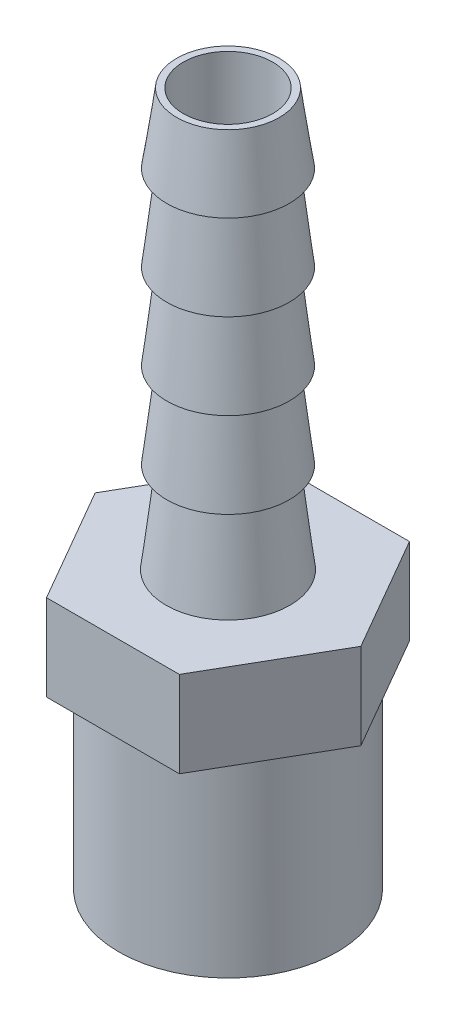
ISO-10303-21;
HEADER;
FILE_DESCRIPTION(('STEP AP214'),'2;1');
FILE_NAME('part.step','',(''),(''),'','','');
FILE_SCHEMA(('AUTOMOTIVE_DESIGN { 1 0 10303 214 1 1 1 1 }'));
ENDSEC;
DATA;
#1=APPLICATION_CONTEXT('core data for automotive mechanical design processes');
#2=APPLICATION_PROTOCOL_DEFINITION('international standard','automotive_design',2000,#1);
#3=PRODUCT_CONTEXT('',#1,'mechanical');
#4=PRODUCT('Part','Part','',(#3));
#5=PRODUCT_RELATED_PRODUCT_CATEGORY('part','',(#4));
#6=PRODUCT_DEFINITION_FORMATION('','',#4);
#7=PRODUCT_DEFINITION_CONTEXT('part definition',#1,'design');
#8=PRODUCT_DEFINITION('design','',#6,#7);
#9=PRODUCT_DEFINITION_SHAPE('','',#8);
#10=(LENGTH_UNIT() NAMED_UNIT(*) SI_UNIT(.MILLI.,.METRE.));
#11=(NAMED_UNIT(*) PLANE_ANGLE_UNIT() SI_UNIT($,.RADIAN.));
#12=(NAMED_UNIT(*) SI_UNIT($,.STERADIAN.) SOLID_ANGLE_UNIT());
#13=UNCERTAINTY_MEASURE_WITH_UNIT(LENGTH_MEASURE(1.E-05),#10,'distance_accuracy_value','');
#14=(GEOMETRIC_REPRESENTATION_CONTEXT(3) GLOBAL_UNCERTAINTY_ASSIGNED_CONTEXT((#13)) GLOBAL_UNIT_ASSIGNED_CONTEXT((#10,
#11,#12)) REPRESENTATION_CONTEXT('',''));
#15=CARTESIAN_POINT('',(0.,0.,0.));
#16=DIRECTION('',(0.,0.,1.));
#17=DIRECTION('',(1.,0.,0.));
#18=AXIS2_PLACEMENT_3D('',#15,#16,#17);
#19=CARTESIAN_POINT('',(0.,-5.2,0.));
#20=DIRECTION('',(0.,1.,0.));
#21=DIRECTION('',(0.,0.,1.));
#22=AXIS2_PLACEMENT_3D('',#19,#20,#21);
#23=PLANE('',#22);
#24=CARTESIAN_POINT('',(0.,-5.2,0.));
#25=DIRECTION('',(0.,1.,0.));
#26=DIRECTION('',(0.,0.,1.));
#27=AXIS2_PLACEMENT_3D('',#24,#25,#26);
#28=CIRCLE('',#27,2.7);
#29=CARTESIAN_POINT('',(0.,-5.2,2.7));
#30=VERTEX_POINT('',#29);
#31=EDGE_CURVE('E141',#30,#30,#28,.T.);
#32=ORIENTED_EDGE('',*,*,#31,.T.);
#33=EDGE_LOOP('',(#32));
#34=FACE_BOUND('',#33,.T.);
#35=CARTESIAN_POINT('',(0.,-5.2,0.));
#36=DIRECTION('',(0.,-1.,0.));
#37=DIRECTION('',(0.,0.,-1.));
#38=AXIS2_PLACEMENT_3D('',#35,#36,#37);
#39=CIRCLE('',#38,4.5);
#40=CARTESIAN_POINT('',(0.,-5.2,-4.5));
#41=VERTEX_POINT('',#40);
#42=EDGE_CURVE('E451',#41,#41,#39,.T.);
#43=ORIENTED_EDGE('',*,*,#42,.T.);
#44=EDGE_LOOP('',(#43));
#45=FACE_BOUND('',#44,.T.);
#46=ADVANCED_FACE('F41',(#34,#45),#23,.F.);
#47=CARTESIAN_POINT('',(4.0125843708679,-5.2,6.95));
#48=DIRECTION('',(0.866025403784439,0.,0.5));
#49=DIRECTION('',(0.5,0.,-0.866025403784439));
#50=AXIS2_PLACEMENT_3D('',#47,#48,#49);
#51=PLANE('',#50);
#52=DIRECTION('',(0.5,0.,-0.866025403784439));
#53=VECTOR('',#52,1.);
#54=CARTESIAN_POINT('',(4.0125843708679,0.,6.95));
#55=LINE('',#54,#53);
#56=CARTESIAN_POINT('',(4.0125843708679,0.,6.95));
#57=VERTEX_POINT('',#56);
#58=CARTESIAN_POINT('',(8.0251687417358,0.,0.));
#59=VERTEX_POINT('',#58);
#60=EDGE_CURVE('E136',#57,#59,#55,.T.);
#61=ORIENTED_EDGE('',*,*,#60,.F.);
#62=DIRECTION('',(0.,1.,0.));
#63=VECTOR('',#62,1.);
#64=CARTESIAN_POINT('',(4.0125843708679,-5.2,6.95));
#65=LINE('',#64,#63);
#66=CARTESIAN_POINT('',(4.0125843708679,-5.2,6.95));
#67=VERTEX_POINT('',#66);
#68=EDGE_CURVE('E60',#67,#57,#65,.T.);
#69=ORIENTED_EDGE('',*,*,#68,.F.);
#70=DIRECTION('',(0.5,0.,-0.866025403784439));
#71=VECTOR('',#70,1.);
#72=CARTESIAN_POINT('',(4.0125843708679,-5.2,6.95));
#73=LINE('',#72,#71);
#74=CARTESIAN_POINT('',(8.0251687417358,-5.2,0.));
#75=VERTEX_POINT('',#74);
#76=EDGE_CURVE('E158',#67,#75,#73,.T.);
#77=ORIENTED_EDGE('',*,*,#76,.T.);
#78=DIRECTION('',(0.,1.,0.));
#79=VECTOR('',#78,1.);
#80=CARTESIAN_POINT('',(8.0251687417358,-5.2,0.));
#81=LINE('',#80,#79);
#82=EDGE_CURVE('E95',#75,#59,#81,.T.);
#83=ORIENTED_EDGE('',*,*,#82,.T.);
#84=EDGE_LOOP('',(#61,#69,#77,#83));
#85=FACE_BOUND('',#84,.T.);
#86=ADVANCED_FACE('F43',(#85),#51,.T.);
#87=CARTESIAN_POINT('',(-4.01258437086789,-5.2,6.95));
#88=DIRECTION('',(0.,0.,1.));
#89=DIRECTION('',(1.,0.,0.));
#90=AXIS2_PLACEMENT_3D('',#87,#88,#89);
#91=PLANE('',#90);
#92=DIRECTION('',(1.,0.,0.));
#93=VECTOR('',#92,1.);
#94=CARTESIAN_POINT('',(-4.01258437086789,0.,6.95));
#95=LINE('',#94,#93);
#96=CARTESIAN_POINT('',(-4.01258437086789,0.,6.95));
#97=VERTEX_POINT('',#96);
#98=EDGE_CURVE('E154',#97,#57,#95,.T.);
#99=ORIENTED_EDGE('',*,*,#98,.F.);
#100=DIRECTION('',(0.,1.,0.));
#101=VECTOR('',#100,1.);
#102=CARTESIAN_POINT('',(-4.01258437086789,-5.2,6.95));
#103=LINE('',#102,#101);
#104=CARTESIAN_POINT('',(-4.01258437086789,-5.2,6.95));
#105=VERTEX_POINT('',#104);
#106=EDGE_CURVE('E83',#105,#97,#103,.T.);
#107=ORIENTED_EDGE('',*,*,#106,.F.);
#108=DIRECTION('',(1.,0.,0.));
#109=VECTOR('',#108,1.);
#110=CARTESIAN_POINT('',(-4.01258437086789,-5.2,6.95));
#111=LINE('',#110,#109);
#112=EDGE_CURVE('E122',#105,#67,#111,.T.);
#113=ORIENTED_EDGE('',*,*,#112,.T.);
#114=ORIENTED_EDGE('',*,*,#68,.T.);
#115=EDGE_LOOP('',(#99,#107,#113,#114));
#116=FACE_BOUND('',#115,.T.);
#117=ADVANCED_FACE('F172',(#116),#91,.T.);
#118=CARTESIAN_POINT('',(-8.0251687417358,-5.2,0.));
#119=DIRECTION('',(-0.866025403784439,0.,0.5));
#120=DIRECTION('',(0.5,0.,0.866025403784439));
#121=AXIS2_PLACEMENT_3D('',#118,#119,#120);
#122=PLANE('',#121);
#123=DIRECTION('',(0.5,0.,0.866025403784439));
#124=VECTOR('',#123,1.);
#125=CARTESIAN_POINT('',(-8.0251687417358,0.,0.));
#126=LINE('',#125,#124);
#127=CARTESIAN_POINT('',(-8.0251687417358,0.,0.));
#128=VERTEX_POINT('',#127);
#129=EDGE_CURVE('E108',#128,#97,#126,.T.);
#130=ORIENTED_EDGE('',*,*,#129,.F.);
#131=DIRECTION('',(0.,1.,0.));
#132=VECTOR('',#131,1.);
#133=CARTESIAN_POINT('',(-8.0251687417358,-5.2,0.));
#134=LINE('',#133,#132);
#135=CARTESIAN_POINT('',(-8.0251687417358,-5.2,0.));
#136=VERTEX_POINT('',#135);
#137=EDGE_CURVE('E103',#136,#128,#134,.T.);
#138=ORIENTED_EDGE('',*,*,#137,.F.);
#139=DIRECTION('',(0.5,0.,0.866025403784439));
#140=VECTOR('',#139,1.);
#141=CARTESIAN_POINT('',(-8.0251687417358,-5.2,0.));
#142=LINE('',#141,#140);
#143=EDGE_CURVE('E106',#136,#105,#142,.T.);
#144=ORIENTED_EDGE('',*,*,#143,.T.);
#145=ORIENTED_EDGE('',*,*,#106,.T.);
#146=EDGE_LOOP('',(#130,#138,#144,#145));
#147=FACE_BOUND('',#146,.T.);
#148=ADVANCED_FACE('F105',(#147),#122,.T.);
#149=CARTESIAN_POINT('',(-4.0125843708679,-5.2,-6.95));
#150=DIRECTION('',(-0.866025403784439,0.,-0.5));
#151=DIRECTION('',(-0.5,0.,0.866025403784439));
#152=AXIS2_PLACEMENT_3D('',#149,#150,#151);
#153=PLANE('',#152);
#154=DIRECTION('',(-0.5,0.,0.866025403784439));
#155=VECTOR('',#154,1.);
#156=CARTESIAN_POINT('',(-4.0125843708679,0.,-6.95));
#157=LINE('',#156,#155);
#158=CARTESIAN_POINT('',(-4.0125843708679,0.,-6.95));
#159=VERTEX_POINT('',#158);
#160=EDGE_CURVE('E149',#159,#128,#157,.T.);
#161=ORIENTED_EDGE('',*,*,#160,.F.);
#162=DIRECTION('',(0.,1.,0.));
#163=VECTOR('',#162,1.);
#164=CARTESIAN_POINT('',(-4.0125843708679,-5.2,-6.95));
#165=LINE('',#164,#163);
#166=CARTESIAN_POINT('',(-4.0125843708679,-5.2,-6.95));
#167=VERTEX_POINT('',#166);
#168=EDGE_CURVE('E114',#167,#159,#165,.T.);
#169=ORIENTED_EDGE('',*,*,#168,.F.);
#170=DIRECTION('',(-0.5,0.,0.866025403784439));
#171=VECTOR('',#170,1.);
#172=CARTESIAN_POINT('',(-4.0125843708679,-5.2,-6.95));
#173=LINE('',#172,#171);
#174=EDGE_CURVE('E120',#167,#136,#173,.T.);
#175=ORIENTED_EDGE('',*,*,#174,.T.);
#176=ORIENTED_EDGE('',*,*,#137,.T.);
#177=EDGE_LOOP('',(#161,#169,#175,#176));
#178=FACE_BOUND('',#177,.T.);
#179=ADVANCED_FACE('F125',(#178),#153,.T.);
#180=CARTESIAN_POINT('',(4.0125843708679,-5.2,-6.95));
#181=DIRECTION('',(0.,0.,-1.));
#182=DIRECTION('',(-1.,0.,0.));
#183=AXIS2_PLACEMENT_3D('',#180,#181,#182);
#184=PLANE('',#183);
#185=DIRECTION('',(-1.,0.,0.));
#186=VECTOR('',#185,1.);
#187=CARTESIAN_POINT('',(4.0125843708679,0.,-6.95));
#188=LINE('',#187,#186);
#189=CARTESIAN_POINT('',(4.0125843708679,0.,-6.95));
#190=VERTEX_POINT('',#189);
#191=EDGE_CURVE('E145',#190,#159,#188,.T.);
#192=ORIENTED_EDGE('',*,*,#191,.F.);
#193=DIRECTION('',(0.,1.,0.));
#194=VECTOR('',#193,1.);
#195=CARTESIAN_POINT('',(4.0125843708679,-5.2,-6.95));
#196=LINE('',#195,#194);
#197=CARTESIAN_POINT('',(4.0125843708679,-5.2,-6.95));
#198=VERTEX_POINT('',#197);
#199=EDGE_CURVE('E165',#198,#190,#196,.T.);
#200=ORIENTED_EDGE('',*,*,#199,.F.);
#201=DIRECTION('',(-1.,0.,0.));
#202=VECTOR('',#201,1.);
#203=CARTESIAN_POINT('',(4.0125843708679,-5.2,-6.95));
#204=LINE('',#203,#202);
#205=EDGE_CURVE('E127',#198,#167,#204,.T.);
#206=ORIENTED_EDGE('',*,*,#205,.T.);
#207=ORIENTED_EDGE('',*,*,#168,.T.);
#208=EDGE_LOOP('',(#192,#200,#206,#207));
#209=FACE_BOUND('',#208,.T.);
#210=ADVANCED_FACE('F197',(#209),#184,.T.);
#211=CARTESIAN_POINT('',(8.0251687417358,-5.2,0.));
#212=DIRECTION('',(0.866025403784438,0.,-0.5));
#213=DIRECTION('',(-0.5,0.,-0.866025403784439));
#214=AXIS2_PLACEMENT_3D('',#211,#212,#213);
#215=PLANE('',#214);
#216=DIRECTION('',(-0.5,0.,-0.866025403784438));
#217=VECTOR('',#216,1.);
#218=CARTESIAN_POINT('',(8.0251687417358,0.,0.));
#219=LINE('',#218,#217);
#220=EDGE_CURVE('E140',#59,#190,#219,.T.);
#221=ORIENTED_EDGE('',*,*,#220,.F.);
#222=ORIENTED_EDGE('',*,*,#82,.F.);
#223=DIRECTION('',(-0.5,0.,-0.866025403784438));
#224=VECTOR('',#223,1.);
#225=CARTESIAN_POINT('',(8.0251687417358,-5.2,0.));
#226=LINE('',#225,#224);
#227=EDGE_CURVE('E130',#75,#198,#226,.T.);
#228=ORIENTED_EDGE('',*,*,#227,.T.);
#229=ORIENTED_EDGE('',*,*,#199,.T.);
#230=EDGE_LOOP('',(#221,#222,#228,#229));
#231=FACE_BOUND('',#230,.T.);
#232=ADVANCED_FACE('F168',(#231),#215,.T.);
#233=CARTESIAN_POINT('',(0.,-5.2,0.));
#234=DIRECTION('',(0.,-1.,0.));
#235=DIRECTION('',(0.,0.,-1.));
#236=AXIS2_PLACEMENT_3D('',#233,#234,#235);
#237=CIRCLE('',#236,6.6);
#238=CARTESIAN_POINT('',(0.,-5.2,-6.6));
#239=VERTEX_POINT('',#238);
#240=EDGE_CURVE('E12',#239,#239,#237,.T.);
#241=ORIENTED_EDGE('',*,*,#240,.F.);
#242=EDGE_LOOP('',(#241));
#243=FACE_BOUND('',#242,.T.);
#244=ORIENTED_EDGE('',*,*,#76,.F.);
#245=ORIENTED_EDGE('',*,*,#112,.F.);
#246=ORIENTED_EDGE('',*,*,#143,.F.);
#247=ORIENTED_EDGE('',*,*,#174,.F.);
#248=ORIENTED_EDGE('',*,*,#205,.F.);
#249=ORIENTED_EDGE('',*,*,#227,.F.);
#250=EDGE_LOOP('',(#244,#245,#246,#247,#248,#249));
#251=FACE_BOUND('',#250,.T.);
#252=ADVANCED_FACE('F118',(#243,#251),#23,.F.);
#253=CARTESIAN_POINT('',(0.,0.,0.));
#254=DIRECTION('',(0.,1.,0.));
#255=DIRECTION('',(0.,0.,1.));
#256=AXIS2_PLACEMENT_3D('',#253,#254,#255);
#257=PLANE('',#256);
#258=CARTESIAN_POINT('',(0.,0.,0.));
#259=DIRECTION('',(0.,1.,0.));
#260=DIRECTION('',(0.,0.,1.));
#261=AXIS2_PLACEMENT_3D('',#258,#259,#260);
#262=CIRCLE('',#261,3.73870967741935);
#263=CARTESIAN_POINT('',(0.,0.,3.73870967741935));
#264=VERTEX_POINT('',#263);
#265=EDGE_CURVE('E45',#264,#264,#262,.T.);
#266=ORIENTED_EDGE('',*,*,#265,.F.);
#267=EDGE_LOOP('',(#266));
#268=FACE_BOUND('',#267,.T.);
#269=ORIENTED_EDGE('',*,*,#60,.T.);
#270=ORIENTED_EDGE('',*,*,#220,.T.);
#271=ORIENTED_EDGE('',*,*,#191,.T.);
#272=ORIENTED_EDGE('',*,*,#160,.T.);
#273=ORIENTED_EDGE('',*,*,#129,.T.);
#274=ORIENTED_EDGE('',*,*,#98,.T.);
#275=EDGE_LOOP('',(#269,#270,#271,#272,#273,#274));
#276=FACE_BOUND('',#275,.T.);
#277=ADVANCED_FACE('F171',(#268,#276),#257,.T.);
#278=CARTESIAN_POINT('',(0.,-5.2,0.));
#279=DIRECTION('',(0.,1.,0.));
#280=DIRECTION('',(0.,0.,1.));
#281=AXIS2_PLACEMENT_3D('',#278,#279,#280);
#282=CYLINDRICAL_SURFACE('',#281,2.7);
#283=ORIENTED_EDGE('',*,*,#31,.F.);
#284=EDGE_LOOP('',(#283));
#285=FACE_BOUND('',#284,.T.);
#286=CARTESIAN_POINT('',(0.,25.2,0.));
#287=DIRECTION('',(0.,-1.,0.));
#288=DIRECTION('',(0.,0.,-1.));
#289=AXIS2_PLACEMENT_3D('',#286,#287,#288);
#290=CIRCLE('',#289,2.7);
#291=CARTESIAN_POINT('',(0.,25.2,-2.7));
#292=VERTEX_POINT('',#291);
#293=EDGE_CURVE('E263',#292,#292,#290,.T.);
#294=ORIENTED_EDGE('',*,*,#293,.F.);
#295=EDGE_LOOP('',(#294));
#296=FACE_BOUND('',#295,.T.);
#297=ADVANCED_FACE('F195',(#285,#296),#282,.F.);
#298=CARTESIAN_POINT('',(2.7,25.2,0.));
#299=DIRECTION('',(0.,1.,0.));
#300=DIRECTION('',(0.,0.,1.));
#301=AXIS2_PLACEMENT_3D('',#298,#299,#300);
#302=PLANE('',#301);
#303=ORIENTED_EDGE('',*,*,#293,.T.);
#304=EDGE_LOOP('',(#303));
#305=FACE_BOUND('',#304,.T.);
#306=CARTESIAN_POINT('',(0.,25.2,0.));
#307=DIRECTION('',(0.,-1.,0.));
#308=DIRECTION('',(0.,0.,-1.));
#309=AXIS2_PLACEMENT_3D('',#306,#307,#308);
#310=CIRCLE('',#309,3.1);
#311=CARTESIAN_POINT('',(0.,25.2,-3.1));
#312=VERTEX_POINT('',#311);
#313=EDGE_CURVE('E265',#312,#312,#310,.T.);
#314=ORIENTED_EDGE('',*,*,#313,.F.);
#315=EDGE_LOOP('',(#314));
#316=FACE_BOUND('',#315,.T.);
#317=ADVANCED_FACE('F251',(#305,#316),#302,.T.);
#318=CARTESIAN_POINT('',(0.,21.,0.));
#319=DIRECTION('',(0.,-1.,0.));
#320=DIRECTION('',(0.,0.,-1.));
#321=AXIS2_PLACEMENT_3D('',#318,#319,#320);
#322=CONICAL_SURFACE('',#321,3.7,0.141897054604164);
#323=ORIENTED_EDGE('',*,*,#313,.T.);
#324=EDGE_LOOP('',(#323));
#325=FACE_BOUND('',#324,.T.);
#326=CARTESIAN_POINT('',(0.,21.,0.));
#327=DIRECTION('',(0.,-1.,0.));
#328=DIRECTION('',(0.,0.,-1.));
#329=AXIS2_PLACEMENT_3D('',#326,#327,#328);
#330=CIRCLE('',#329,3.7);
#331=CARTESIAN_POINT('',(0.,21.,-3.7));
#332=VERTEX_POINT('',#331);
#333=EDGE_CURVE('E271',#332,#332,#330,.T.);
#334=ORIENTED_EDGE('',*,*,#333,.F.);
#335=EDGE_LOOP('',(#334));
#336=FACE_BOUND('',#335,.T.);
#337=ADVANCED_FACE('F247',(#325,#336),#322,.T.);
#338=CARTESIAN_POINT('',(3.7,21.,0.));
#339=DIRECTION('',(0.,-1.,0.));
#340=DIRECTION('',(0.,0.,-1.));
#341=AXIS2_PLACEMENT_3D('',#338,#339,#340);
#342=PLANE('',#341);
#343=ORIENTED_EDGE('',*,*,#333,.T.);
#344=EDGE_LOOP('',(#343));
#345=FACE_BOUND('',#344,.T.);
#346=CARTESIAN_POINT('',(0.,21.,0.));
#347=DIRECTION('',(0.,-1.,0.));
#348=DIRECTION('',(0.,0.,-1.));
#349=AXIS2_PLACEMENT_3D('',#346,#347,#348);
#350=CIRCLE('',#349,3.1);
#351=CARTESIAN_POINT('',(0.,21.,-3.1));
#352=VERTEX_POINT('',#351);
#353=EDGE_CURVE('E416',#352,#352,#350,.T.);
#354=ORIENTED_EDGE('',*,*,#353,.F.);
#355=EDGE_LOOP('',(#354));
#356=FACE_BOUND('',#355,.T.);
#357=ADVANCED_FACE('F243',(#345,#356),#342,.T.);
#358=CARTESIAN_POINT('',(0.,15.8333333333333,0.));
#359=DIRECTION('',(0.,-1.,0.));
#360=DIRECTION('',(0.,0.,-1.));
#361=AXIS2_PLACEMENT_3D('',#358,#359,#360);
#362=CONICAL_SURFACE('',#361,3.7,0.115611179231885);
#363=ORIENTED_EDGE('',*,*,#353,.T.);
#364=EDGE_LOOP('',(#363));
#365=FACE_BOUND('',#364,.T.);
#366=CARTESIAN_POINT('',(0.,15.8333333333333,0.));
#367=DIRECTION('',(0.,-1.,0.));
#368=DIRECTION('',(0.,0.,-1.));
#369=AXIS2_PLACEMENT_3D('',#366,#367,#368);
#370=CIRCLE('',#369,3.7);
#371=CARTESIAN_POINT('',(0.,15.8333333333333,-3.7));
#372=VERTEX_POINT('',#371);
#373=EDGE_CURVE('E420',#372,#372,#370,.T.);
#374=ORIENTED_EDGE('',*,*,#373,.F.);
#375=EDGE_LOOP('',(#374));
#376=FACE_BOUND('',#375,.T.);
#377=ADVANCED_FACE('F239',(#365,#376),#362,.T.);
#378=CARTESIAN_POINT('',(3.7,15.8333333333333,0.));
#379=DIRECTION('',(0.,-1.,0.));
#380=DIRECTION('',(0.,0.,-1.));
#381=AXIS2_PLACEMENT_3D('',#378,#379,#380);
#382=PLANE('',#381);
#383=ORIENTED_EDGE('',*,*,#373,.T.);
#384=EDGE_LOOP('',(#383));
#385=FACE_BOUND('',#384,.T.);
#386=CARTESIAN_POINT('',(0.,15.8333333333333,0.));
#387=DIRECTION('',(0.,-1.,0.));
#388=DIRECTION('',(0.,0.,-1.));
#389=AXIS2_PLACEMENT_3D('',#386,#387,#388);
#390=CIRCLE('',#389,3.1);
#391=CARTESIAN_POINT('',(0.,15.8333333333333,-3.1));
#392=VERTEX_POINT('',#391);
#393=EDGE_CURVE('E424',#392,#392,#390,.T.);
#394=ORIENTED_EDGE('',*,*,#393,.F.);
#395=EDGE_LOOP('',(#394));
#396=FACE_BOUND('',#395,.T.);
#397=ADVANCED_FACE('F235',(#385,#396),#382,.T.);
#398=CARTESIAN_POINT('',(0.,10.6666666666667,0.));
#399=DIRECTION('',(0.,-1.,0.));
#400=DIRECTION('',(0.,0.,-1.));
#401=AXIS2_PLACEMENT_3D('',#398,#399,#400);
#402=CONICAL_SURFACE('',#401,3.7,0.115611179231885);
#403=ORIENTED_EDGE('',*,*,#393,.T.);
#404=EDGE_LOOP('',(#403));
#405=FACE_BOUND('',#404,.T.);
#406=CARTESIAN_POINT('',(0.,10.6666666666667,0.));
#407=DIRECTION('',(0.,-1.,0.));
#408=DIRECTION('',(0.,0.,-1.));
#409=AXIS2_PLACEMENT_3D('',#406,#407,#408);
#410=CIRCLE('',#409,3.7);
#411=CARTESIAN_POINT('',(0.,10.6666666666667,-3.7));
#412=VERTEX_POINT('',#411);
#413=EDGE_CURVE('E428',#412,#412,#410,.T.);
#414=ORIENTED_EDGE('',*,*,#413,.F.);
#415=EDGE_LOOP('',(#414));
#416=FACE_BOUND('',#415,.T.);
#417=ADVANCED_FACE('F231',(#405,#416),#402,.T.);
#418=CARTESIAN_POINT('',(3.7,10.6666666666667,0.));
#419=DIRECTION('',(0.,-1.,0.));
#420=DIRECTION('',(0.,0.,-1.));
#421=AXIS2_PLACEMENT_3D('',#418,#419,#420);
#422=PLANE('',#421);
#423=ORIENTED_EDGE('',*,*,#413,.T.);
#424=EDGE_LOOP('',(#423));
#425=FACE_BOUND('',#424,.T.);
#426=CARTESIAN_POINT('',(0.,10.6666666666667,0.));
#427=DIRECTION('',(0.,-1.,0.));
#428=DIRECTION('',(0.,0.,-1.));
#429=AXIS2_PLACEMENT_3D('',#426,#427,#428);
#430=CIRCLE('',#429,3.1);
#431=CARTESIAN_POINT('',(0.,10.6666666666667,-3.1));
#432=VERTEX_POINT('',#431);
#433=EDGE_CURVE('E432',#432,#432,#430,.T.);
#434=ORIENTED_EDGE('',*,*,#433,.F.);
#435=EDGE_LOOP('',(#434));
#436=FACE_BOUND('',#435,.T.);
#437=ADVANCED_FACE('F227',(#425,#436),#422,.T.);
#438=CARTESIAN_POINT('',(0.,5.5,0.));
#439=DIRECTION('',(0.,-1.,0.));
#440=DIRECTION('',(0.,0.,-1.));
#441=AXIS2_PLACEMENT_3D('',#438,#439,#440);
#442=CONICAL_SURFACE('',#441,3.7,0.115611179231885);
#443=ORIENTED_EDGE('',*,*,#433,.T.);
#444=EDGE_LOOP('',(#443));
#445=FACE_BOUND('',#444,.T.);
#446=CARTESIAN_POINT('',(0.,5.5,0.));
#447=DIRECTION('',(0.,-1.,0.));
#448=DIRECTION('',(0.,0.,-1.));
#449=AXIS2_PLACEMENT_3D('',#446,#447,#448);
#450=CIRCLE('',#449,3.7);
#451=CARTESIAN_POINT('',(0.,5.5,-3.7));
#452=VERTEX_POINT('',#451);
#453=EDGE_CURVE('E436',#452,#452,#450,.T.);
#454=ORIENTED_EDGE('',*,*,#453,.F.);
#455=EDGE_LOOP('',(#454));
#456=FACE_BOUND('',#455,.T.);
#457=ADVANCED_FACE('F223',(#445,#456),#442,.T.);
#458=CARTESIAN_POINT('',(3.7,5.5,0.));
#459=DIRECTION('',(0.,-1.,0.));
#460=DIRECTION('',(0.,0.,-1.));
#461=AXIS2_PLACEMENT_3D('',#458,#459,#460);
#462=PLANE('',#461);
#463=ORIENTED_EDGE('',*,*,#453,.T.);
#464=EDGE_LOOP('',(#463));
#465=FACE_BOUND('',#464,.T.);
#466=CARTESIAN_POINT('',(0.,5.5,0.));
#467=DIRECTION('',(0.,-1.,0.));
#468=DIRECTION('',(0.,0.,-1.));
#469=AXIS2_PLACEMENT_3D('',#466,#467,#468);
#470=CIRCLE('',#469,3.1);
#471=CARTESIAN_POINT('',(0.,5.5,-3.1));
#472=VERTEX_POINT('',#471);
#473=EDGE_CURVE('E440',#472,#472,#470,.T.);
#474=ORIENTED_EDGE('',*,*,#473,.F.);
#475=EDGE_LOOP('',(#474));
#476=FACE_BOUND('',#475,.T.);
#477=ADVANCED_FACE('F213',(#465,#476),#462,.T.);
#478=CARTESIAN_POINT('',(0.,0.,0.));
#479=DIRECTION('',(0.,-1.,0.));
#480=DIRECTION('',(0.,0.,-1.));
#481=AXIS2_PLACEMENT_3D('',#478,#479,#480);
#482=CONICAL_SURFACE('',#481,3.73870967741935,0.115611179231885);
#483=ORIENTED_EDGE('',*,*,#473,.T.);
#484=EDGE_LOOP('',(#483));
#485=FACE_BOUND('',#484,.T.);
#486=ORIENTED_EDGE('',*,*,#265,.T.);
#487=EDGE_LOOP('',(#486));
#488=FACE_BOUND('',#487,.T.);
#489=ADVANCED_FACE('F203',(#485,#488),#482,.T.);
#490=CARTESIAN_POINT('',(0.,-52.0676190233249,0.));
#491=DIRECTION('',(0.,1.,0.));
#492=DIRECTION('',(0.,0.,1.));
#493=AXIS2_PLACEMENT_3D('',#490,#491,#492);
#494=CYLINDRICAL_SURFACE('',#493,6.6);
#495=CARTESIAN_POINT('',(0.,-16.7,0.));
#496=DIRECTION('',(0.,1.,0.));
#497=DIRECTION('',(0.,0.,1.));
#498=AXIS2_PLACEMENT_3D('',#495,#496,#497);
#499=CIRCLE('',#498,6.6);
#500=CARTESIAN_POINT('',(0.,-16.7,6.6));
#501=VERTEX_POINT('',#500);
#502=EDGE_CURVE('E448',#501,#501,#499,.T.);
#503=ORIENTED_EDGE('',*,*,#502,.T.);
#504=EDGE_LOOP('',(#503));
#505=FACE_BOUND('',#504,.T.);
#506=ORIENTED_EDGE('',*,*,#240,.T.);
#507=EDGE_LOOP('',(#506));
#508=FACE_BOUND('',#507,.T.);
#509=ADVANCED_FACE('F200',(#505,#508),#494,.T.);
#510=CARTESIAN_POINT('',(0.,-52.0676190233249,0.));
#511=DIRECTION('',(0.,1.,0.));
#512=DIRECTION('',(0.,0.,1.));
#513=AXIS2_PLACEMENT_3D('',#510,#511,#512);
#514=CYLINDRICAL_SURFACE('',#513,4.5);
#515=CARTESIAN_POINT('',(0.,-16.7,0.));
#516=DIRECTION('',(0.,1.,0.));
#517=DIRECTION('',(0.,0.,1.));
#518=AXIS2_PLACEMENT_3D('',#515,#516,#517);
#519=CIRCLE('',#518,4.5);
#520=CARTESIAN_POINT('',(0.,-16.7,4.5));
#521=VERTEX_POINT('',#520);
#522=EDGE_CURVE('E444',#521,#521,#519,.T.);
#523=ORIENTED_EDGE('',*,*,#522,.F.);
#524=EDGE_LOOP('',(#523));
#525=FACE_BOUND('',#524,.T.);
#526=ORIENTED_EDGE('',*,*,#42,.F.);
#527=EDGE_LOOP('',(#526));
#528=FACE_BOUND('',#527,.T.);
#529=ADVANCED_FACE('F202',(#525,#528),#514,.F.);
#530=CARTESIAN_POINT('',(0.,-16.7,0.));
#531=DIRECTION('',(0.,1.,0.));
#532=DIRECTION('',(0.,0.,1.));
#533=AXIS2_PLACEMENT_3D('',#530,#531,#532);
#534=PLANE('',#533);
#535=ORIENTED_EDGE('',*,*,#522,.T.);
#536=EDGE_LOOP('',(#535));
#537=FACE_BOUND('',#536,.T.);
#538=ORIENTED_EDGE('',*,*,#502,.F.);
#539=EDGE_LOOP('',(#538));
#540=FACE_BOUND('',#539,.T.);
#541=ADVANCED_FACE('F210',(#537,#540),#534,.F.);
#542=CLOSED_SHELL('',(#46,#86,#117,#148,#179,#210,#232,#252,#277,#297,#317,#337,#357,#377,#397,
#417,#437,#457,#477,#489,#509,#529,#541));
#543=MANIFOLD_SOLID_BREP('B2',#542);
#544=ADVANCED_BREP_SHAPE_REPRESENTATION('',(#18,#543),#14);
#545=SHAPE_DEFINITION_REPRESENTATION(#9,#544);
ENDSEC;
END-ISO-10303-21;
